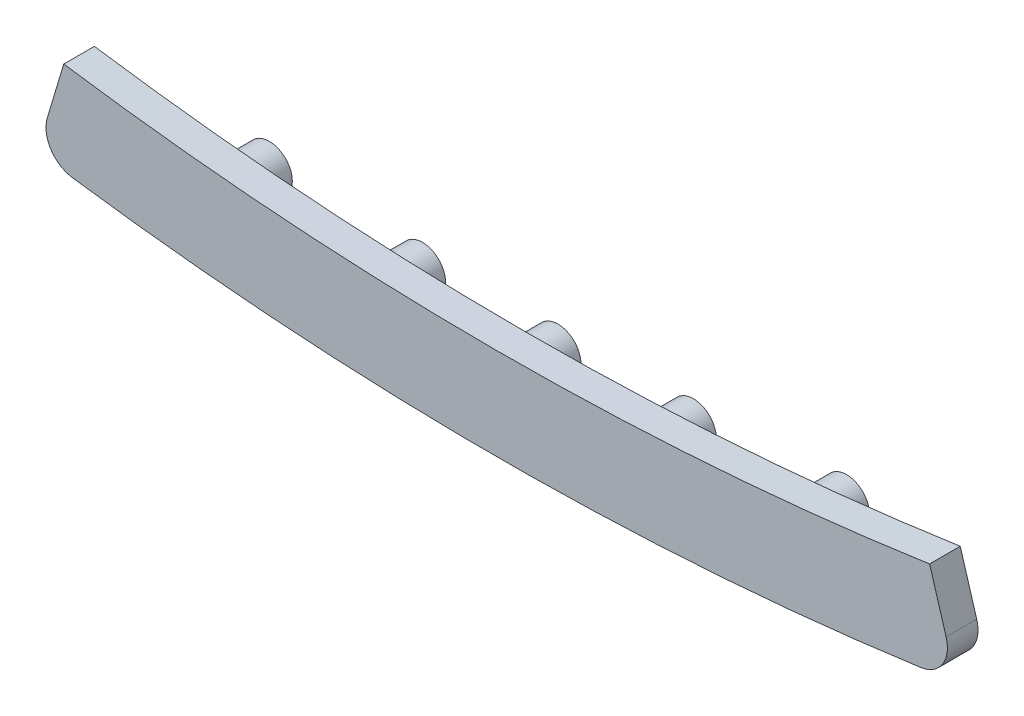
ISO-10303-21;
HEADER;
FILE_DESCRIPTION(('STEP AP214'),'2;1');
FILE_NAME('part.step','',(''),(''),'','','');
FILE_SCHEMA(('AUTOMOTIVE_DESIGN { 1 0 10303 214 1 1 1 1 }'));
ENDSEC;
DATA;
#1=APPLICATION_CONTEXT('core data for automotive mechanical design processes');
#2=APPLICATION_PROTOCOL_DEFINITION('international standard','automotive_design',2000,#1);
#3=PRODUCT_CONTEXT('',#1,'mechanical');
#4=PRODUCT('Part','Part','',(#3));
#5=PRODUCT_RELATED_PRODUCT_CATEGORY('part','',(#4));
#6=PRODUCT_DEFINITION_FORMATION('','',#4);
#7=PRODUCT_DEFINITION_CONTEXT('part definition',#1,'design');
#8=PRODUCT_DEFINITION('design','',#6,#7);
#9=PRODUCT_DEFINITION_SHAPE('','',#8);
#10=(LENGTH_UNIT() NAMED_UNIT(*) SI_UNIT(.MILLI.,.METRE.));
#11=(NAMED_UNIT(*) PLANE_ANGLE_UNIT() SI_UNIT($,.RADIAN.));
#12=(NAMED_UNIT(*) SI_UNIT($,.STERADIAN.) SOLID_ANGLE_UNIT());
#13=UNCERTAINTY_MEASURE_WITH_UNIT(LENGTH_MEASURE(1.E-05),#10,'distance_accuracy_value','');
#14=(GEOMETRIC_REPRESENTATION_CONTEXT(3) GLOBAL_UNCERTAINTY_ASSIGNED_CONTEXT((#13)) GLOBAL_UNIT_ASSIGNED_CONTEXT((#10,
#11,#12)) REPRESENTATION_CONTEXT('',''));
#15=CARTESIAN_POINT('',(0.,0.,0.));
#16=DIRECTION('',(0.,0.,1.));
#17=DIRECTION('',(1.,0.,0.));
#18=AXIS2_PLACEMENT_3D('',#15,#16,#17);
#19=CARTESIAN_POINT('',(0.,28.,-2.));
#20=DIRECTION('',(0.,0.,-1.));
#21=DIRECTION('',(-1.,0.,0.));
#22=AXIS2_PLACEMENT_3D('',#19,#20,#21);
#23=PLANE('',#22);
#24=CARTESIAN_POINT('',(0.,-36.5,-2.));
#25=DIRECTION('',(0.,0.,-1.));
#26=DIRECTION('',(-1.,0.,0.));
#27=AXIS2_PLACEMENT_3D('',#24,#25,#26);
#28=CIRCLE('',#27,1.5);
#29=CARTESIAN_POINT('',(-1.5,-36.5,-2.));
#30=VERTEX_POINT('',#29);
#31=EDGE_CURVE('E58',#30,#30,#28,.F.);
#32=ORIENTED_EDGE('',*,*,#31,.F.);
#33=EDGE_LOOP('',(#32));
#34=FACE_BOUND('',#33,.T.);
#35=ADVANCED_FACE('F51',(#34),#23,.T.);
#36=CARTESIAN_POINT('',(0.,-36.5,0.));
#37=DIRECTION('',(0.,0.,1.));
#38=DIRECTION('',(1.,0.,0.));
#39=AXIS2_PLACEMENT_3D('',#36,#37,#38);
#40=PLANE('',#39);
#41=CARTESIAN_POINT('',(0.,-36.5,0.));
#42=DIRECTION('',(0.,0.,1.));
#43=DIRECTION('',(1.,0.,0.));
#44=AXIS2_PLACEMENT_3D('',#41,#42,#43);
#45=CIRCLE('',#44,1.5);
#46=CARTESIAN_POINT('',(1.5,-36.5,0.));
#47=VERTEX_POINT('',#46);
#48=EDGE_CURVE('E11',#47,#47,#45,.T.);
#49=ORIENTED_EDGE('',*,*,#48,.T.);
#50=EDGE_LOOP('',(#49));
#51=FACE_BOUND('',#50,.T.);
#52=ADVANCED_FACE('F53',(#51),#40,.T.);
#53=CARTESIAN_POINT('',(0.,-36.5,-6.24264068711929));
#54=DIRECTION('',(0.,0.,1.));
#55=DIRECTION('',(1.,0.,0.));
#56=AXIS2_PLACEMENT_3D('',#53,#54,#55);
#57=CYLINDRICAL_SURFACE('',#56,1.5);
#58=ORIENTED_EDGE('',*,*,#48,.F.);
#59=EDGE_LOOP('',(#58));
#60=FACE_BOUND('',#59,.T.);
#61=ORIENTED_EDGE('',*,*,#31,.T.);
#62=EDGE_LOOP('',(#61));
#63=FACE_BOUND('',#62,.T.);
#64=ADVANCED_FACE('F64',(#60,#63),#57,.T.);
#65=CLOSED_SHELL('',(#35,#52,#64));
#66=MANIFOLD_SOLID_BREP('B2',#65);
#67=CARTESIAN_POINT('',(0.,28.,-2.));
#68=DIRECTION('',(0.,0.,-1.));
#69=DIRECTION('',(-1.,0.,0.));
#70=AXIS2_PLACEMENT_3D('',#67,#68,#69);
#71=PLANE('',#70);
#72=CARTESIAN_POINT('',(18.8390986621441,-35.5925123155633,-2.));
#73=DIRECTION('',(0.,0.,-1.));
#74=DIRECTION('',(-1.,0.,0.));
#75=AXIS2_PLACEMENT_3D('',#72,#73,#74);
#76=CIRCLE('',#75,1.5);
#77=CARTESIAN_POINT('',(17.3390986621441,-35.5925123155633,-2.));
#78=VERTEX_POINT('',#77);
#79=EDGE_CURVE('E49',#78,#78,#76,.F.);
#80=ORIENTED_EDGE('',*,*,#79,.F.);
#81=EDGE_LOOP('',(#80));
#82=FACE_BOUND('',#81,.T.);
#83=ADVANCED_FACE('F98',(#82),#71,.T.);
#84=CARTESIAN_POINT('',(18.8390986621441,-35.5925123155633,-6.24264068711929));
#85=DIRECTION('',(0.,0.,1.));
#86=DIRECTION('',(1.,0.,0.));
#87=AXIS2_PLACEMENT_3D('',#84,#85,#86);
#88=CYLINDRICAL_SURFACE('',#87,1.5);
#89=CARTESIAN_POINT('',(18.8390986621441,-35.5925123155633,0.));
#90=DIRECTION('',(0.,0.,1.));
#91=DIRECTION('',(1.,0.,0.));
#92=AXIS2_PLACEMENT_3D('',#89,#90,#91);
#93=CIRCLE('',#92,1.5);
#94=CARTESIAN_POINT('',(20.3390986621441,-35.5925123155633,0.));
#95=VERTEX_POINT('',#94);
#96=EDGE_CURVE('E106',#95,#95,#93,.T.);
#97=ORIENTED_EDGE('',*,*,#96,.F.);
#98=EDGE_LOOP('',(#97));
#99=FACE_BOUND('',#98,.T.);
#100=ORIENTED_EDGE('',*,*,#79,.T.);
#101=EDGE_LOOP('',(#100));
#102=FACE_BOUND('',#101,.T.);
#103=ADVANCED_FACE('F268',(#99,#102),#88,.T.);
#104=CARTESIAN_POINT('',(0.,159.5,0.));
#105=DIRECTION('',(0.,0.,1.));
#106=DIRECTION('',(1.,0.,0.));
#107=AXIS2_PLACEMENT_3D('',#104,#105,#106);
#108=PLANE('',#107);
#109=CARTESIAN_POINT('',(-18.8390986621441,-35.5925123155627,0.));
#110=DIRECTION('',(0.,0.,1.));
#111=DIRECTION('',(1.,0.,0.));
#112=AXIS2_PLACEMENT_3D('',#109,#110,#111);
#113=CIRCLE('',#112,1.5);
#114=CARTESIAN_POINT('',(-17.3390986621441,-35.5925123155627,0.));
#115=VERTEX_POINT('',#114);
#116=EDGE_CURVE('E243',#115,#115,#113,.T.);
#117=ORIENTED_EDGE('',*,*,#116,.T.);
#118=EDGE_LOOP('',(#117));
#119=FACE_BOUND('',#118,.T.);
#120=CARTESIAN_POINT('',(-8.83909866214407,-36.3005881881893,0.));
#121=DIRECTION('',(0.,0.,1.));
#122=DIRECTION('',(1.,0.,0.));
#123=AXIS2_PLACEMENT_3D('',#120,#121,#122);
#124=CIRCLE('',#123,1.5);
#125=CARTESIAN_POINT('',(-7.33909866214406,-36.3005881881893,0.));
#126=VERTEX_POINT('',#125);
#127=EDGE_CURVE('E235',#126,#126,#124,.T.);
#128=ORIENTED_EDGE('',*,*,#127,.T.);
#129=EDGE_LOOP('',(#128));
#130=FACE_BOUND('',#129,.T.);
#131=CARTESIAN_POINT('',(8.83909866214407,-36.3005881881895,0.));
#132=DIRECTION('',(0.,0.,1.));
#133=DIRECTION('',(1.,0.,0.));
#134=AXIS2_PLACEMENT_3D('',#131,#132,#133);
#135=CIRCLE('',#134,1.5);
#136=CARTESIAN_POINT('',(10.3390986621441,-36.3005881881895,0.));
#137=VERTEX_POINT('',#136);
#138=EDGE_CURVE('E177',#137,#137,#135,.T.);
#139=ORIENTED_EDGE('',*,*,#138,.T.);
#140=EDGE_LOOP('',(#139));
#141=FACE_BOUND('',#140,.T.);
#142=ORIENTED_EDGE('',*,*,#96,.T.);
#143=EDGE_LOOP('',(#142));
#144=FACE_BOUND('',#143,.T.);
#145=CARTESIAN_POINT('',(0.,159.5,0.));
#146=DIRECTION('',(0.,0.,-1.));
#147=DIRECTION('',(1.,0.,0.));
#148=AXIS2_PLACEMENT_3D('',#145,#146,#147);
#149=CIRCLE('',#148,194.);
#150=CARTESIAN_POINT('',(28.2584637507618,-32.4308709573499,0.));
#151=VERTEX_POINT('',#150);
#152=CARTESIAN_POINT('',(-28.2584637507619,-32.4308709573498,0.));
#153=VERTEX_POINT('',#152);
#154=EDGE_CURVE('E166',#151,#153,#149,.T.);
#155=ORIENTED_EDGE('',*,*,#154,.F.);
#156=DIRECTION('',(-0.287293058587041,0.95784273160457,0.));
#157=VECTOR('',#156,1.);
#158=CARTESIAN_POINT('',(29.334314751328,-36.0177869317559,0.));
#159=LINE('',#158,#157);
#160=CARTESIAN_POINT('',(29.334314751328,-36.0177869317559,0.));
#161=VERTEX_POINT('',#160);
#162=EDGE_CURVE('E197',#161,#151,#159,.T.);
#163=ORIENTED_EDGE('',*,*,#162,.F.);
#164=CARTESIAN_POINT('',(27.4186292881189,-36.59237304893,0.));
#165=DIRECTION('',(0.,0.,1.));
#166=DIRECTION('',(1.,0.,0.));
#167=AXIS2_PLACEMENT_3D('',#164,#165,#166);
#168=CIRCLE('',#167,1.99999999999999);
#169=CARTESIAN_POINT('',(27.695585139514,-38.5731040898283,0.));
#170=VERTEX_POINT('',#169);
#171=EDGE_CURVE('E193',#170,#161,#168,.T.);
#172=ORIENTED_EDGE('',*,*,#171,.F.);
#173=CARTESIAN_POINT('',(0.,159.5,0.));
#174=DIRECTION('',(0.,0.,1.));
#175=DIRECTION('',(1.,0.,0.));
#176=AXIS2_PLACEMENT_3D('',#173,#174,#175);
#177=CIRCLE('',#176,200.);
#178=CARTESIAN_POINT('',(-27.6955851395141,-38.5731040898283,0.));
#179=VERTEX_POINT('',#178);
#180=EDGE_CURVE('E189',#179,#170,#177,.T.);
#181=ORIENTED_EDGE('',*,*,#180,.F.);
#182=CARTESIAN_POINT('',(-27.4186292881188,-36.59237304893,0.));
#183=DIRECTION('',(0.,0.,1.));
#184=DIRECTION('',(1.,0.,0.));
#185=AXIS2_PLACEMENT_3D('',#182,#183,#184);
#186=CIRCLE('',#185,2.);
#187=CARTESIAN_POINT('',(-29.334314751328,-36.0177869317559,0.));
#188=VERTEX_POINT('',#187);
#189=EDGE_CURVE('E169',#188,#179,#186,.T.);
#190=ORIENTED_EDGE('',*,*,#189,.F.);
#191=DIRECTION('',(-0.28729305858701,-0.957842731604579,0.));
#192=VECTOR('',#191,1.);
#193=CARTESIAN_POINT('',(-28.2584637507619,-32.4308709573498,0.));
#194=LINE('',#193,#192);
#195=EDGE_CURVE('E153',#153,#188,#194,.T.);
#196=ORIENTED_EDGE('',*,*,#195,.F.);
#197=EDGE_LOOP('',(#155,#163,#172,#181,#190,#196));
#198=FACE_BOUND('',#197,.T.);
#199=ADVANCED_FACE('F164',(#119,#130,#141,#144,#198),#108,.F.);
#200=CARTESIAN_POINT('',(29.334314751328,-36.0177869317559,61.3879940751832));
#201=DIRECTION('',(-0.957842731604569,-0.28729305858704,0.));
#202=DIRECTION('',(0.287293058587041,-0.95784273160457,0.));
#203=AXIS2_PLACEMENT_3D('',#200,#201,#202);
#204=PLANE('',#203);
#205=DIRECTION('',(0.,0.,-1.));
#206=VECTOR('',#205,1.);
#207=CARTESIAN_POINT('',(28.2584637507618,-32.4308709573499,61.3879940751832));
#208=LINE('',#207,#206);
#209=CARTESIAN_POINT('',(28.2584637507618,-32.4308709573499,2.));
#210=VERTEX_POINT('',#209);
#211=EDGE_CURVE('E174',#210,#151,#208,.T.);
#212=ORIENTED_EDGE('',*,*,#211,.F.);
#213=DIRECTION('',(0.287293058587041,-0.95784273160457,0.));
#214=VECTOR('',#213,1.);
#215=CARTESIAN_POINT('',(29.334314751328,-36.0177869317559,2.));
#216=LINE('',#215,#214);
#217=CARTESIAN_POINT('',(29.334314751328,-36.0177869317559,2.));
#218=VERTEX_POINT('',#217);
#219=EDGE_CURVE('E159',#210,#218,#216,.T.);
#220=ORIENTED_EDGE('',*,*,#219,.T.);
#221=DIRECTION('',(0.,0.,-1.));
#222=VECTOR('',#221,1.);
#223=CARTESIAN_POINT('',(29.334314751328,-36.0177869317559,61.3879940751832));
#224=LINE('',#223,#222);
#225=EDGE_CURVE('E202',#218,#161,#224,.T.);
#226=ORIENTED_EDGE('',*,*,#225,.T.);
#227=ORIENTED_EDGE('',*,*,#162,.T.);
#228=EDGE_LOOP('',(#212,#220,#226,#227));
#229=FACE_BOUND('',#228,.T.);
#230=ADVANCED_FACE('F279',(#229),#204,.F.);
#231=CARTESIAN_POINT('',(27.4186292881189,-36.59237304893,61.3879940751832));
#232=DIRECTION('',(0.,0.,-1.));
#233=DIRECTION('',(-1.,0.,0.));
#234=AXIS2_PLACEMENT_3D('',#231,#232,#233);
#235=CYLINDRICAL_SURFACE('',#234,1.99999999999999);
#236=ORIENTED_EDGE('',*,*,#225,.F.);
#237=CARTESIAN_POINT('',(27.4186292881189,-36.59237304893,2.));
#238=DIRECTION('',(0.,0.,-1.));
#239=DIRECTION('',(-1.,0.,0.));
#240=AXIS2_PLACEMENT_3D('',#237,#238,#239);
#241=CIRCLE('',#240,1.99999999999999);
#242=CARTESIAN_POINT('',(27.695585139514,-38.5731040898283,2.));
#243=VERTEX_POINT('',#242);
#244=EDGE_CURVE('E215',#218,#243,#241,.T.);
#245=ORIENTED_EDGE('',*,*,#244,.T.);
#246=DIRECTION('',(0.,0.,-1.));
#247=VECTOR('',#246,1.);
#248=CARTESIAN_POINT('',(27.695585139514,-38.5731040898283,61.3879940751832));
#249=LINE('',#248,#247);
#250=EDGE_CURVE('E205',#243,#170,#249,.T.);
#251=ORIENTED_EDGE('',*,*,#250,.T.);
#252=ORIENTED_EDGE('',*,*,#171,.T.);
#253=EDGE_LOOP('',(#236,#245,#251,#252));
#254=FACE_BOUND('',#253,.T.);
#255=ADVANCED_FACE('F295',(#254),#235,.T.);
#256=CARTESIAN_POINT('',(0.,159.5,61.3879940751832));
#257=DIRECTION('',(0.,0.,-1.));
#258=DIRECTION('',(-1.,0.,0.));
#259=AXIS2_PLACEMENT_3D('',#256,#257,#258);
#260=CYLINDRICAL_SURFACE('',#259,200.);
#261=ORIENTED_EDGE('',*,*,#250,.F.);
#262=CARTESIAN_POINT('',(0.,159.5,2.));
#263=DIRECTION('',(0.,0.,-1.));
#264=DIRECTION('',(-1.,0.,0.));
#265=AXIS2_PLACEMENT_3D('',#262,#263,#264);
#266=CIRCLE('',#265,200.);
#267=CARTESIAN_POINT('',(-27.6955851395141,-38.5731040898282,2.));
#268=VERTEX_POINT('',#267);
#269=EDGE_CURVE('E223',#243,#268,#266,.T.);
#270=ORIENTED_EDGE('',*,*,#269,.T.);
#271=DIRECTION('',(0.,0.,-1.));
#272=VECTOR('',#271,1.);
#273=CARTESIAN_POINT('',(-27.6955851395141,-38.5731040898283,61.3879940751832));
#274=LINE('',#273,#272);
#275=EDGE_CURVE('E208',#268,#179,#274,.T.);
#276=ORIENTED_EDGE('',*,*,#275,.T.);
#277=ORIENTED_EDGE('',*,*,#180,.T.);
#278=EDGE_LOOP('',(#261,#270,#276,#277));
#279=FACE_BOUND('',#278,.T.);
#280=ADVANCED_FACE('F291',(#279),#260,.T.);
#281=CARTESIAN_POINT('',(-27.4186292881188,-36.59237304893,61.3879940751832));
#282=DIRECTION('',(0.,0.,-1.));
#283=DIRECTION('',(-1.,0.,0.));
#284=AXIS2_PLACEMENT_3D('',#281,#282,#283);
#285=CYLINDRICAL_SURFACE('',#284,2.);
#286=ORIENTED_EDGE('',*,*,#275,.F.);
#287=CARTESIAN_POINT('',(-27.4186292881188,-36.59237304893,2.));
#288=DIRECTION('',(0.,0.,-1.));
#289=DIRECTION('',(-1.,0.,0.));
#290=AXIS2_PLACEMENT_3D('',#287,#288,#289);
#291=CIRCLE('',#290,2.);
#292=CARTESIAN_POINT('',(-29.334314751328,-36.0177869317559,2.));
#293=VERTEX_POINT('',#292);
#294=EDGE_CURVE('E118',#268,#293,#291,.T.);
#295=ORIENTED_EDGE('',*,*,#294,.T.);
#296=DIRECTION('',(0.,0.,-1.));
#297=VECTOR('',#296,1.);
#298=CARTESIAN_POINT('',(-29.334314751328,-36.0177869317559,61.3879940751832));
#299=LINE('',#298,#297);
#300=EDGE_CURVE('E160',#293,#188,#299,.T.);
#301=ORIENTED_EDGE('',*,*,#300,.T.);
#302=ORIENTED_EDGE('',*,*,#189,.T.);
#303=EDGE_LOOP('',(#286,#295,#301,#302));
#304=FACE_BOUND('',#303,.T.);
#305=ADVANCED_FACE('F288',(#304),#285,.T.);
#306=CARTESIAN_POINT('',(-28.2584637507619,-32.4308709573498,61.3879940751832));
#307=DIRECTION('',(0.957842731604578,-0.28729305858701,0.));
#308=DIRECTION('',(0.28729305858701,0.957842731604579,0.));
#309=AXIS2_PLACEMENT_3D('',#306,#307,#308);
#310=PLANE('',#309);
#311=ORIENTED_EDGE('',*,*,#300,.F.);
#312=DIRECTION('',(0.28729305858701,0.957842731604579,0.));
#313=VECTOR('',#312,1.);
#314=CARTESIAN_POINT('',(-28.2584637507619,-32.4308709573498,2.));
#315=LINE('',#314,#313);
#316=CARTESIAN_POINT('',(-28.2584637507619,-32.4308709573498,2.));
#317=VERTEX_POINT('',#316);
#318=EDGE_CURVE('E113',#293,#317,#315,.T.);
#319=ORIENTED_EDGE('',*,*,#318,.T.);
#320=DIRECTION('',(0.,0.,-1.));
#321=VECTOR('',#320,1.);
#322=CARTESIAN_POINT('',(-28.2584637507619,-32.4308709573498,61.3879940751832));
#323=LINE('',#322,#321);
#324=EDGE_CURVE('E150',#317,#153,#323,.T.);
#325=ORIENTED_EDGE('',*,*,#324,.T.);
#326=ORIENTED_EDGE('',*,*,#195,.T.);
#327=EDGE_LOOP('',(#311,#319,#325,#326));
#328=FACE_BOUND('',#327,.T.);
#329=ADVANCED_FACE('F152',(#328),#310,.F.);
#330=CARTESIAN_POINT('',(0.,159.5,61.3879940751832));
#331=DIRECTION('',(0.,0.,-1.));
#332=DIRECTION('',(-1.,0.,0.));
#333=AXIS2_PLACEMENT_3D('',#330,#331,#332);
#334=CYLINDRICAL_SURFACE('',#333,194.);
#335=ORIENTED_EDGE('',*,*,#324,.F.);
#336=CARTESIAN_POINT('',(0.,159.5,2.));
#337=DIRECTION('',(0.,0.,-1.));
#338=DIRECTION('',(-1.,0.,0.));
#339=AXIS2_PLACEMENT_3D('',#336,#337,#338);
#340=CIRCLE('',#339,194.);
#341=EDGE_CURVE('E184',#317,#210,#340,.F.);
#342=ORIENTED_EDGE('',*,*,#341,.T.);
#343=ORIENTED_EDGE('',*,*,#211,.T.);
#344=ORIENTED_EDGE('',*,*,#154,.T.);
#345=EDGE_LOOP('',(#335,#342,#343,#344));
#346=FACE_BOUND('',#345,.T.);
#347=ADVANCED_FACE('F172',(#346),#334,.F.);
#348=CARTESIAN_POINT('',(0.,28.,2.));
#349=DIRECTION('',(0.,0.,-1.));
#350=DIRECTION('',(-1.,0.,0.));
#351=AXIS2_PLACEMENT_3D('',#348,#349,#350);
#352=PLANE('',#351);
#353=ORIENTED_EDGE('',*,*,#318,.F.);
#354=ORIENTED_EDGE('',*,*,#294,.F.);
#355=ORIENTED_EDGE('',*,*,#269,.F.);
#356=ORIENTED_EDGE('',*,*,#244,.F.);
#357=ORIENTED_EDGE('',*,*,#219,.F.);
#358=ORIENTED_EDGE('',*,*,#341,.F.);
#359=EDGE_LOOP('',(#353,#354,#355,#356,#357,#358));
#360=FACE_BOUND('',#359,.T.);
#361=ADVANCED_FACE('F285',(#360),#352,.F.);
#362=CARTESIAN_POINT('',(0.,28.,-2.));
#363=DIRECTION('',(0.,0.,-1.));
#364=DIRECTION('',(-1.,0.,0.));
#365=AXIS2_PLACEMENT_3D('',#362,#363,#364);
#366=PLANE('',#365);
#367=CARTESIAN_POINT('',(8.83909866214407,-36.3005881881895,-2.));
#368=DIRECTION('',(0.,0.,-1.));
#369=DIRECTION('',(-1.,0.,0.));
#370=AXIS2_PLACEMENT_3D('',#367,#368,#369);
#371=CIRCLE('',#370,1.5);
#372=CARTESIAN_POINT('',(7.33909866214407,-36.3005881881895,-2.));
#373=VERTEX_POINT('',#372);
#374=EDGE_CURVE('E181',#373,#373,#371,.F.);
#375=ORIENTED_EDGE('',*,*,#374,.F.);
#376=EDGE_LOOP('',(#375));
#377=FACE_BOUND('',#376,.T.);
#378=ADVANCED_FACE('F305',(#377),#366,.T.);
#379=CARTESIAN_POINT('',(8.83909866214407,-36.3005881881895,-6.24264068711929));
#380=DIRECTION('',(0.,0.,1.));
#381=DIRECTION('',(1.,0.,0.));
#382=AXIS2_PLACEMENT_3D('',#379,#380,#381);
#383=CYLINDRICAL_SURFACE('',#382,1.5);
#384=ORIENTED_EDGE('',*,*,#138,.F.);
#385=EDGE_LOOP('',(#384));
#386=FACE_BOUND('',#385,.T.);
#387=ORIENTED_EDGE('',*,*,#374,.T.);
#388=EDGE_LOOP('',(#387));
#389=FACE_BOUND('',#388,.T.);
#390=ADVANCED_FACE('F306',(#386,#389),#383,.T.);
#391=CARTESIAN_POINT('',(0.,28.,-2.));
#392=DIRECTION('',(0.,0.,-1.));
#393=DIRECTION('',(-1.,0.,0.));
#394=AXIS2_PLACEMENT_3D('',#391,#392,#393);
#395=PLANE('',#394);
#396=CARTESIAN_POINT('',(-8.83909866214407,-36.3005881881893,-2.));
#397=DIRECTION('',(0.,0.,-1.));
#398=DIRECTION('',(-1.,0.,0.));
#399=AXIS2_PLACEMENT_3D('',#396,#397,#398);
#400=CIRCLE('',#399,1.5);
#401=CARTESIAN_POINT('',(-10.3390986621441,-36.3005881881893,-2.));
#402=VERTEX_POINT('',#401);
#403=EDGE_CURVE('E239',#402,#402,#400,.F.);
#404=ORIENTED_EDGE('',*,*,#403,.F.);
#405=EDGE_LOOP('',(#404));
#406=FACE_BOUND('',#405,.T.);
#407=ADVANCED_FACE('F264',(#406),#395,.T.);
#408=CARTESIAN_POINT('',(-8.83909866214407,-36.3005881881893,-6.24264068711929));
#409=DIRECTION('',(0.,0.,1.));
#410=DIRECTION('',(1.,0.,0.));
#411=AXIS2_PLACEMENT_3D('',#408,#409,#410);
#412=CYLINDRICAL_SURFACE('',#411,1.5);
#413=ORIENTED_EDGE('',*,*,#127,.F.);
#414=EDGE_LOOP('',(#413));
#415=FACE_BOUND('',#414,.T.);
#416=ORIENTED_EDGE('',*,*,#403,.T.);
#417=EDGE_LOOP('',(#416));
#418=FACE_BOUND('',#417,.T.);
#419=ADVANCED_FACE('F256',(#415,#418),#412,.T.);
#420=CARTESIAN_POINT('',(0.,28.,-2.));
#421=DIRECTION('',(0.,0.,-1.));
#422=DIRECTION('',(-1.,0.,0.));
#423=AXIS2_PLACEMENT_3D('',#420,#421,#422);
#424=PLANE('',#423);
#425=CARTESIAN_POINT('',(-18.8390986621441,-35.5925123155627,-2.));
#426=DIRECTION('',(0.,0.,-1.));
#427=DIRECTION('',(-1.,0.,0.));
#428=AXIS2_PLACEMENT_3D('',#425,#426,#427);
#429=CIRCLE('',#428,1.5);
#430=CARTESIAN_POINT('',(-20.3390986621441,-35.5925123155627,-2.));
#431=VERTEX_POINT('',#430);
#432=EDGE_CURVE('E247',#431,#431,#429,.F.);
#433=ORIENTED_EDGE('',*,*,#432,.F.);
#434=EDGE_LOOP('',(#433));
#435=FACE_BOUND('',#434,.T.);
#436=ADVANCED_FACE('F254',(#435),#424,.T.);
#437=CARTESIAN_POINT('',(-18.8390986621441,-35.5925123155627,-6.24264068711929));
#438=DIRECTION('',(0.,0.,1.));
#439=DIRECTION('',(1.,0.,0.));
#440=AXIS2_PLACEMENT_3D('',#437,#438,#439);
#441=CYLINDRICAL_SURFACE('',#440,1.5);
#442=ORIENTED_EDGE('',*,*,#116,.F.);
#443=EDGE_LOOP('',(#442));
#444=FACE_BOUND('',#443,.T.);
#445=ORIENTED_EDGE('',*,*,#432,.T.);
#446=EDGE_LOOP('',(#445));
#447=FACE_BOUND('',#446,.T.);
#448=ADVANCED_FACE('F252',(#444,#447),#441,.T.);
#449=CLOSED_SHELL('',(#83,#103,#199,#230,#255,#280,#305,#329,#347,#361,#378,#390,#407,#419,#436,#448));
#450=MANIFOLD_SOLID_BREP('B6',#449);
#451=ADVANCED_BREP_SHAPE_REPRESENTATION('',(#18,#66,#450),#14);
#452=SHAPE_DEFINITION_REPRESENTATION(#9,#451);
ENDSEC;
END-ISO-10303-21;
